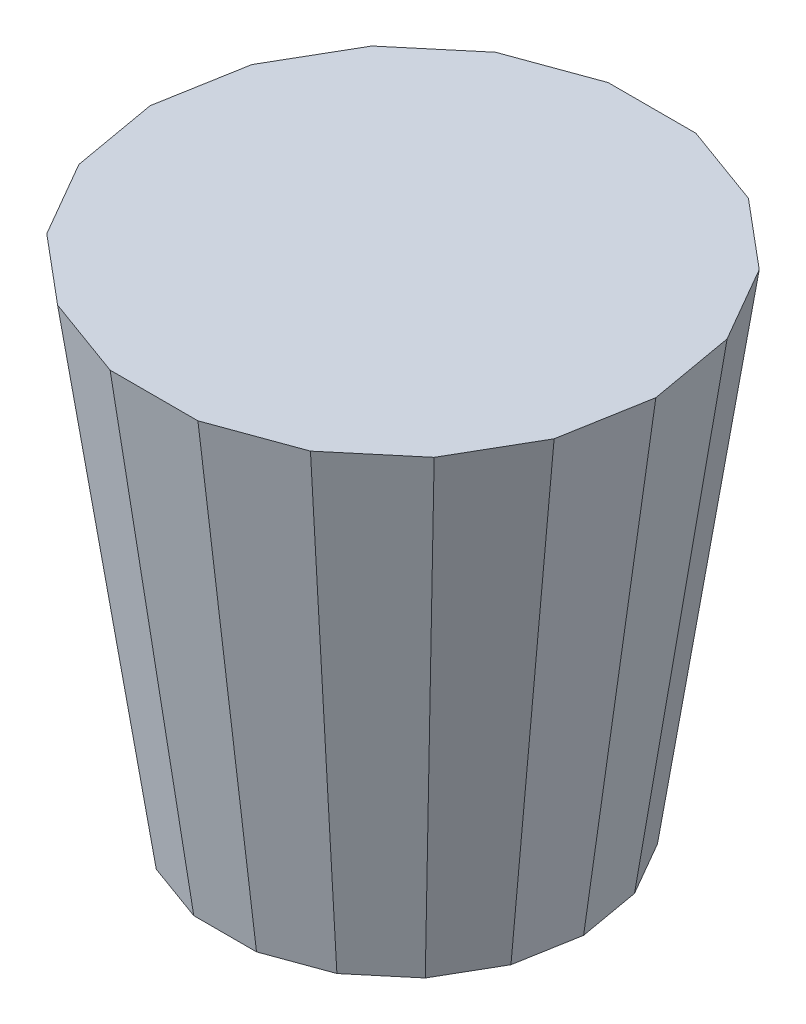
ISO-10303-21;
HEADER;
FILE_DESCRIPTION(('STEP AP214'),'2;1');
FILE_NAME('part.step','',(''),(''),'','','');
FILE_SCHEMA(('AUTOMOTIVE_DESIGN { 1 0 10303 214 1 1 1 1 }'));
ENDSEC;
DATA;
#1=APPLICATION_CONTEXT('core data for automotive mechanical design processes');
#2=APPLICATION_PROTOCOL_DEFINITION('international standard','automotive_design',2000,#1);
#3=PRODUCT_CONTEXT('',#1,'mechanical');
#4=PRODUCT('Part','Part','',(#3));
#5=PRODUCT_RELATED_PRODUCT_CATEGORY('part','',(#4));
#6=PRODUCT_DEFINITION_FORMATION('','',#4);
#7=PRODUCT_DEFINITION_CONTEXT('part definition',#1,'design');
#8=PRODUCT_DEFINITION('design','',#6,#7);
#9=PRODUCT_DEFINITION_SHAPE('','',#8);
#10=(LENGTH_UNIT() NAMED_UNIT(*) SI_UNIT(.MILLI.,.METRE.));
#11=(NAMED_UNIT(*) PLANE_ANGLE_UNIT() SI_UNIT($,.RADIAN.));
#12=(NAMED_UNIT(*) SI_UNIT($,.STERADIAN.) SOLID_ANGLE_UNIT());
#13=UNCERTAINTY_MEASURE_WITH_UNIT(LENGTH_MEASURE(1.E-05),#10,'distance_accuracy_value','');
#14=(GEOMETRIC_REPRESENTATION_CONTEXT(3) GLOBAL_UNCERTAINTY_ASSIGNED_CONTEXT((#13)) GLOBAL_UNIT_ASSIGNED_CONTEXT((#10,
#11,#12)) REPRESENTATION_CONTEXT('',''));
#15=CARTESIAN_POINT('',(0.,0.,0.));
#16=DIRECTION('',(0.,0.,1.));
#17=DIRECTION('',(1.,0.,0.));
#18=AXIS2_PLACEMENT_3D('',#15,#16,#17);
#19=CARTESIAN_POINT('',(0.,-254.,0.));
#20=DIRECTION('',(0.,1.,0.));
#21=DIRECTION('',(0.,0.,1.));
#22=AXIS2_PLACEMENT_3D('',#19,#20,#21);
#23=PLANE('',#22);
#24=DIRECTION('',(-0.5,0.,0.866025403784439));
#25=VECTOR('',#24,1.);
#26=CARTESIAN_POINT('',(-70.0321517789801,-254.,-58.7639527282935));
#27=LINE('',#26,#25);
#28=CARTESIAN_POINT('',(-70.0321517789801,-254.,-58.7639527282935));
#29=VERTEX_POINT('',#28);
#30=CARTESIAN_POINT('',(-85.9071517789802,-254.,-31.2676461581375));
#31=VERTEX_POINT('',#30);
#32=EDGE_CURVE('E392',#29,#31,#27,.T.);
#33=ORIENTED_EDGE('',*,*,#32,.F.);
#34=DIRECTION('',(-0.766044443118977,0.,0.64278760968654));
#35=VECTOR('',#34,1.);
#36=CARTESIAN_POINT('',(-45.7102407099527,-254.,-79.1724593358411));
#37=LINE('',#36,#35);
#38=CARTESIAN_POINT('',(-45.7102407099527,-254.,-79.1724593358411));
#39=VERTEX_POINT('',#38);
#40=EDGE_CURVE('E382',#39,#29,#37,.T.);
#41=ORIENTED_EDGE('',*,*,#40,.F.);
#42=DIRECTION('',(-0.939692620785908,0.,0.34202014332567));
#43=VECTOR('',#42,1.);
#44=CARTESIAN_POINT('',(-15.875,-254.,-90.0315988864311));
#45=LINE('',#44,#43);
#46=CARTESIAN_POINT('',(-15.875,-254.,-90.0315988864311));
#47=VERTEX_POINT('',#46);
#48=EDGE_CURVE('E407',#47,#39,#45,.T.);
#49=ORIENTED_EDGE('',*,*,#48,.F.);
#50=DIRECTION('',(-1.,0.,0.));
#51=VECTOR('',#50,1.);
#52=CARTESIAN_POINT('',(15.8749999999998,-254.,-90.0315988864311));
#53=LINE('',#52,#51);
#54=CARTESIAN_POINT('',(15.8749999999998,-254.,-90.0315988864311));
#55=VERTEX_POINT('',#54);
#56=EDGE_CURVE('E593',#55,#47,#53,.T.);
#57=ORIENTED_EDGE('',*,*,#56,.F.);
#58=DIRECTION('',(-0.939692620785908,0.,-0.342020143325669));
#59=VECTOR('',#58,1.);
#60=CARTESIAN_POINT('',(45.7102407099525,-254.,-79.1724593358411));
#61=LINE('',#60,#59);
#62=CARTESIAN_POINT('',(45.7102407099525,-254.,-79.1724593358411));
#63=VERTEX_POINT('',#62);
#64=EDGE_CURVE('E589',#63,#55,#61,.T.);
#65=ORIENTED_EDGE('',*,*,#64,.F.);
#66=DIRECTION('',(-0.766044443118978,0.,-0.642787609686539));
#67=VECTOR('',#66,1.);
#68=CARTESIAN_POINT('',(70.0321517789801,-254.,-58.7639527282935));
#69=LINE('',#68,#67);
#70=CARTESIAN_POINT('',(70.0321517789801,-254.,-58.7639527282935));
#71=VERTEX_POINT('',#70);
#72=EDGE_CURVE('E585',#71,#63,#69,.T.);
#73=ORIENTED_EDGE('',*,*,#72,.F.);
#74=DIRECTION('',(-0.5,0.,-0.866025403784439));
#75=VECTOR('',#74,1.);
#76=CARTESIAN_POINT('',(85.90715177898,-254.,-31.2676461581376));
#77=LINE('',#76,#75);
#78=CARTESIAN_POINT('',(85.90715177898,-254.,-31.2676461581376));
#79=VERTEX_POINT('',#78);
#80=EDGE_CURVE('E581',#79,#71,#77,.T.);
#81=ORIENTED_EDGE('',*,*,#80,.F.);
#82=DIRECTION('',(-0.173648177666931,0.,-0.984807753012208));
#83=VECTOR('',#82,1.);
#84=CARTESIAN_POINT('',(91.4204814199051,-254.,0.));
#85=LINE('',#84,#83);
#86=CARTESIAN_POINT('',(91.4204814199051,-254.,0.));
#87=VERTEX_POINT('',#86);
#88=EDGE_CURVE('E577',#87,#79,#85,.T.);
#89=ORIENTED_EDGE('',*,*,#88,.F.);
#90=DIRECTION('',(0.17364817766693,0.,-0.984807753012208));
#91=VECTOR('',#90,1.);
#92=CARTESIAN_POINT('',(85.9071517789801,-254.,31.2676461581375));
#93=LINE('',#92,#91);
#94=CARTESIAN_POINT('',(85.9071517789801,-254.,31.2676461581375));
#95=VERTEX_POINT('',#94);
#96=EDGE_CURVE('E573',#95,#87,#93,.T.);
#97=ORIENTED_EDGE('',*,*,#96,.F.);
#98=DIRECTION('',(0.5,0.,-0.866025403784439));
#99=VECTOR('',#98,1.);
#100=CARTESIAN_POINT('',(70.0321517789801,-254.,58.7639527282935));
#101=LINE('',#100,#99);
#102=CARTESIAN_POINT('',(70.0321517789801,-254.,58.7639527282935));
#103=VERTEX_POINT('',#102);
#104=EDGE_CURVE('E569',#103,#95,#101,.T.);
#105=ORIENTED_EDGE('',*,*,#104,.F.);
#106=DIRECTION('',(0.766044443118977,0.,-0.64278760968654));
#107=VECTOR('',#106,1.);
#108=CARTESIAN_POINT('',(45.7102407099526,-254.,79.1724593358411));
#109=LINE('',#108,#107);
#110=CARTESIAN_POINT('',(45.7102407099526,-254.,79.1724593358411));
#111=VERTEX_POINT('',#110);
#112=EDGE_CURVE('E565',#111,#103,#109,.T.);
#113=ORIENTED_EDGE('',*,*,#112,.F.);
#114=DIRECTION('',(0.939692620785908,0.,-0.34202014332567));
#115=VECTOR('',#114,1.);
#116=CARTESIAN_POINT('',(15.875,-254.,90.0315988864311));
#117=LINE('',#116,#115);
#118=CARTESIAN_POINT('',(15.875,-254.,90.0315988864311));
#119=VERTEX_POINT('',#118);
#120=EDGE_CURVE('E561',#119,#111,#117,.T.);
#121=ORIENTED_EDGE('',*,*,#120,.F.);
#122=DIRECTION('',(1.,0.,0.));
#123=VECTOR('',#122,1.);
#124=CARTESIAN_POINT('',(-15.875,-254.,90.0315988864311));
#125=LINE('',#124,#123);
#126=CARTESIAN_POINT('',(-15.875,-254.,90.0315988864311));
#127=VERTEX_POINT('',#126);
#128=EDGE_CURVE('E557',#127,#119,#125,.T.);
#129=ORIENTED_EDGE('',*,*,#128,.F.);
#130=DIRECTION('',(0.939692620785908,0.,0.342020143325669));
#131=VECTOR('',#130,1.);
#132=CARTESIAN_POINT('',(-45.7102407099526,-254.,79.1724593358411));
#133=LINE('',#132,#131);
#134=CARTESIAN_POINT('',(-45.7102407099526,-254.,79.1724593358411));
#135=VERTEX_POINT('',#134);
#136=EDGE_CURVE('E553',#135,#127,#133,.T.);
#137=ORIENTED_EDGE('',*,*,#136,.F.);
#138=DIRECTION('',(0.766044443118978,0.,0.642787609686539));
#139=VECTOR('',#138,1.);
#140=CARTESIAN_POINT('',(-70.0321517789801,-254.,58.7639527282935));
#141=LINE('',#140,#139);
#142=CARTESIAN_POINT('',(-70.0321517789801,-254.,58.7639527282935));
#143=VERTEX_POINT('',#142);
#144=EDGE_CURVE('E549',#143,#135,#141,.T.);
#145=ORIENTED_EDGE('',*,*,#144,.F.);
#146=DIRECTION('',(0.5,0.,0.866025403784438));
#147=VECTOR('',#146,1.);
#148=CARTESIAN_POINT('',(-85.9071517789801,-254.,31.2676461581376));
#149=LINE('',#148,#147);
#150=CARTESIAN_POINT('',(-85.9071517789801,-254.,31.2676461581376));
#151=VERTEX_POINT('',#150);
#152=EDGE_CURVE('E544',#151,#143,#149,.T.);
#153=ORIENTED_EDGE('',*,*,#152,.F.);
#154=DIRECTION('',(0.173648177666931,0.,0.984807753012208));
#155=VECTOR('',#154,1.);
#156=CARTESIAN_POINT('',(-91.4204814199051,-254.,0.));
#157=LINE('',#156,#155);
#158=CARTESIAN_POINT('',(-91.4204814199051,-254.,0.));
#159=VERTEX_POINT('',#158);
#160=EDGE_CURVE('E542',#159,#151,#157,.T.);
#161=ORIENTED_EDGE('',*,*,#160,.F.);
#162=DIRECTION('',(-0.173648177666929,0.,0.984807753012208));
#163=VECTOR('',#162,1.);
#164=CARTESIAN_POINT('',(-85.9071517789802,-254.,-31.2676461581375));
#165=LINE('',#164,#163);
#166=EDGE_CURVE('E413',#31,#159,#165,.T.);
#167=ORIENTED_EDGE('',*,*,#166,.F.);
#168=EDGE_LOOP('',(#33,#41,#49,#57,#65,#73,#81,#89,#97,#105,#113,#121,#129,#137,#145,#153,#161,#167));
#169=FACE_BOUND('',#168,.T.);
#170=ADVANCED_FACE('F257',(#169),#23,.F.);
#171=CARTESIAN_POINT('',(0.,0.,0.));
#172=DIRECTION('',(0.,1.,0.));
#173=DIRECTION('',(0.,0.,1.));
#174=AXIS2_PLACEMENT_3D('',#171,#172,#173);
#175=PLANE('',#174);
#176=DIRECTION('',(1.,0.,0.));
#177=VECTOR('',#176,1.);
#178=CARTESIAN_POINT('',(-22.2250000000002,0.,126.044238441004));
#179=LINE('',#178,#177);
#180=CARTESIAN_POINT('',(-22.2250000000002,0.,126.044238441004));
#181=VERTEX_POINT('',#180);
#182=CARTESIAN_POINT('',(22.2249999999998,0.,126.044238441004));
#183=VERTEX_POINT('',#182);
#184=EDGE_CURVE('E615',#181,#183,#179,.T.);
#185=ORIENTED_EDGE('',*,*,#184,.T.);
#186=DIRECTION('',(0.939692620785908,0.,-0.342020143325669));
#187=VECTOR('',#186,1.);
#188=CARTESIAN_POINT('',(22.2249999999998,0.,126.044238441004));
#189=LINE('',#188,#187);
#190=CARTESIAN_POINT('',(63.9943369939339,0.,110.841443070178));
#191=VERTEX_POINT('',#190);
#192=EDGE_CURVE('E616',#183,#191,#189,.T.);
#193=ORIENTED_EDGE('',*,*,#192,.T.);
#194=DIRECTION('',(0.766044443118978,0.,-0.642787609686539));
#195=VECTOR('',#194,1.);
#196=CARTESIAN_POINT('',(63.9943369939339,0.,110.841443070178));
#197=LINE('',#196,#195);
#198=CARTESIAN_POINT('',(98.0450124905725,0.,82.2695338196112));
#199=VERTEX_POINT('',#198);
#200=EDGE_CURVE('E619',#191,#199,#197,.T.);
#201=ORIENTED_EDGE('',*,*,#200,.T.);
#202=DIRECTION('',(0.5,0.,-0.866025403784439));
#203=VECTOR('',#202,1.);
#204=CARTESIAN_POINT('',(98.0450124905725,0.,82.2695338196112));
#205=LINE('',#204,#203);
#206=CARTESIAN_POINT('',(120.270012490573,0.,43.7747046213928));
#207=VERTEX_POINT('',#206);
#208=EDGE_CURVE('E785',#199,#207,#205,.T.);
#209=ORIENTED_EDGE('',*,*,#208,.T.);
#210=DIRECTION('',(0.17364817766693,0.,-0.984807753012208));
#211=VECTOR('',#210,1.);
#212=CARTESIAN_POINT('',(120.270012490573,0.,43.7747046213928));
#213=LINE('',#212,#211);
#214=CARTESIAN_POINT('',(127.988673987868,0.,0.));
#215=VERTEX_POINT('',#214);
#216=EDGE_CURVE('E776',#207,#215,#213,.T.);
#217=ORIENTED_EDGE('',*,*,#216,.T.);
#218=DIRECTION('',(-0.173648177666929,0.,-0.984807753012208));
#219=VECTOR('',#218,1.);
#220=CARTESIAN_POINT('',(127.988673987868,0.,0.));
#221=LINE('',#220,#219);
#222=CARTESIAN_POINT('',(120.270012490573,0.,-43.7747046213926));
#223=VERTEX_POINT('',#222);
#224=EDGE_CURVE('E767',#215,#223,#221,.T.);
#225=ORIENTED_EDGE('',*,*,#224,.T.);
#226=DIRECTION('',(-0.5,0.,-0.866025403784439));
#227=VECTOR('',#226,1.);
#228=CARTESIAN_POINT('',(120.270012490573,0.,-43.7747046213927));
#229=LINE('',#228,#227);
#230=CARTESIAN_POINT('',(98.0450124905725,0.,-82.2695338196111));
#231=VERTEX_POINT('',#230);
#232=EDGE_CURVE('E758',#223,#231,#229,.T.);
#233=ORIENTED_EDGE('',*,*,#232,.T.);
#234=DIRECTION('',(-0.766044443118978,0.,-0.64278760968654));
#235=VECTOR('',#234,1.);
#236=CARTESIAN_POINT('',(98.0450124905725,0.,-82.2695338196111));
#237=LINE('',#236,#235);
#238=CARTESIAN_POINT('',(63.9943369939338,0.,-110.841443070178));
#239=VERTEX_POINT('',#238);
#240=EDGE_CURVE('E749',#231,#239,#237,.T.);
#241=ORIENTED_EDGE('',*,*,#240,.T.);
#242=DIRECTION('',(-0.939692620785908,0.,-0.342020143325669));
#243=VECTOR('',#242,1.);
#244=CARTESIAN_POINT('',(63.9943369939338,0.,-110.841443070178));
#245=LINE('',#244,#243);
#246=CARTESIAN_POINT('',(22.2249999999995,0.,-126.044238441004));
#247=VERTEX_POINT('',#246);
#248=EDGE_CURVE('E740',#239,#247,#245,.T.);
#249=ORIENTED_EDGE('',*,*,#248,.T.);
#250=DIRECTION('',(-1.,0.,0.));
#251=VECTOR('',#250,1.);
#252=CARTESIAN_POINT('',(22.2249999999995,0.,-126.044238441004));
#253=LINE('',#252,#251);
#254=CARTESIAN_POINT('',(-22.2249999999998,0.,-126.044238441004));
#255=VERTEX_POINT('',#254);
#256=EDGE_CURVE('E731',#247,#255,#253,.T.);
#257=ORIENTED_EDGE('',*,*,#256,.T.);
#258=DIRECTION('',(-0.939692620785908,0.,0.342020143325669));
#259=VECTOR('',#258,1.);
#260=CARTESIAN_POINT('',(-22.2249999999998,0.,-126.044238441004));
#261=LINE('',#260,#259);
#262=CARTESIAN_POINT('',(-63.9943369939339,0.,-110.841443070178));
#263=VERTEX_POINT('',#262);
#264=EDGE_CURVE('E722',#255,#263,#261,.T.);
#265=ORIENTED_EDGE('',*,*,#264,.T.);
#266=DIRECTION('',(-0.766044443118978,0.,0.64278760968654));
#267=VECTOR('',#266,1.);
#268=CARTESIAN_POINT('',(-63.9943369939339,0.,-110.841443070178));
#269=LINE('',#268,#267);
#270=CARTESIAN_POINT('',(-98.0450124905726,0.,-82.2695338196112));
#271=VERTEX_POINT('',#270);
#272=EDGE_CURVE('E714',#263,#271,#269,.T.);
#273=ORIENTED_EDGE('',*,*,#272,.T.);
#274=DIRECTION('',(-0.5,0.,0.866025403784439));
#275=VECTOR('',#274,1.);
#276=CARTESIAN_POINT('',(-98.0450124905726,0.,-82.2695338196112));
#277=LINE('',#276,#275);
#278=CARTESIAN_POINT('',(-120.270012490573,0.,-43.7747046213928));
#279=VERTEX_POINT('',#278);
#280=EDGE_CURVE('E396',#271,#279,#277,.T.);
#281=ORIENTED_EDGE('',*,*,#280,.T.);
#282=DIRECTION('',(-0.17364817766693,0.,0.984807753012208));
#283=VECTOR('',#282,1.);
#284=CARTESIAN_POINT('',(-120.270012490573,0.,-43.7747046213928));
#285=LINE('',#284,#283);
#286=CARTESIAN_POINT('',(-127.988673987868,0.,0.));
#287=VERTEX_POINT('',#286);
#288=EDGE_CURVE('E698',#279,#287,#285,.T.);
#289=ORIENTED_EDGE('',*,*,#288,.T.);
#290=DIRECTION('',(0.17364817766693,0.,0.984807753012208));
#291=VECTOR('',#290,1.);
#292=CARTESIAN_POINT('',(-127.988673987868,0.,0.));
#293=LINE('',#292,#291);
#294=CARTESIAN_POINT('',(-120.270012490573,0.,43.7747046213927));
#295=VERTEX_POINT('',#294);
#296=EDGE_CURVE('E689',#287,#295,#293,.T.);
#297=ORIENTED_EDGE('',*,*,#296,.T.);
#298=DIRECTION('',(0.499999999999999,0.,0.866025403784439));
#299=VECTOR('',#298,1.);
#300=CARTESIAN_POINT('',(-120.270012490573,0.,43.7747046213927));
#301=LINE('',#300,#299);
#302=CARTESIAN_POINT('',(-98.0450124905727,0.,82.2695338196112));
#303=VERTEX_POINT('',#302);
#304=EDGE_CURVE('E683',#295,#303,#301,.T.);
#305=ORIENTED_EDGE('',*,*,#304,.T.);
#306=DIRECTION('',(0.766044443118978,0.,0.64278760968654));
#307=VECTOR('',#306,1.);
#308=CARTESIAN_POINT('',(-98.0450124905727,0.,82.2695338196112));
#309=LINE('',#308,#307);
#310=CARTESIAN_POINT('',(-63.994336993934,0.,110.841443070178));
#311=VERTEX_POINT('',#310);
#312=EDGE_CURVE('E269',#303,#311,#309,.T.);
#313=ORIENTED_EDGE('',*,*,#312,.T.);
#314=DIRECTION('',(0.939692620785908,0.,0.34202014332567));
#315=VECTOR('',#314,1.);
#316=CARTESIAN_POINT('',(-63.994336993934,0.,110.841443070178));
#317=LINE('',#316,#315);
#318=EDGE_CURVE('E13',#311,#181,#317,.T.);
#319=ORIENTED_EDGE('',*,*,#318,.T.);
#320=EDGE_LOOP('',(#185,#193,#201,#209,#217,#225,#233,#241,#249,#257,#265,#273,#281,#289,#297,
#305,#313,#319));
#321=FACE_BOUND('',#320,.T.);
#322=ADVANCED_FACE('F434',(#321),#175,.T.);
#323=CARTESIAN_POINT('',(-120.270012490573,0.,43.7747046213927));
#324=DIRECTION('',(-0.975056154422239,-0.140378115037361,0.17192870773048));
#325=DIRECTION('',(-0.17364817766693,0.,-0.984807753012208));
#326=AXIS2_PLACEMENT_3D('',#323,#324,#325);
#327=PLANE('',#326);
#328=ORIENTED_EDGE('',*,*,#296,.F.);
#329=CARTESIAN_POINT('',(-127.988673987868,0.,0.));
#330=CARTESIAN_POINT('',(-115.799276465214,-84.6666666666666,0.));
#331=CARTESIAN_POINT('',(-103.609878942559,-169.333333333333,0.));
#332=CARTESIAN_POINT('',(-91.4204814199051,-254.,0.));
#333=B_SPLINE_CURVE_WITH_KNOTS('',3,(#329,#330,#331,#332),.UNSPECIFIED.,.F.,.F.,(4,4),(0.,1.),.UNSPECIFIED.);
#334=EDGE_CURVE('E925',#287,#159,#333,.T.);
#335=ORIENTED_EDGE('',*,*,#334,.T.);
#336=ORIENTED_EDGE('',*,*,#160,.T.);
#337=CARTESIAN_POINT('',(-120.270012490573,0.,43.7747046213927));
#338=CARTESIAN_POINT('',(-108.815725586709,-84.6666666666667,39.605685133641));
#339=CARTESIAN_POINT('',(-97.3614386828443,-169.333333333333,35.4366656458893));
#340=CARTESIAN_POINT('',(-85.9071517789801,-254.,31.2676461581376));
#341=B_SPLINE_CURVE_WITH_KNOTS('',3,(#337,#338,#339,#340),.UNSPECIFIED.,.F.,.F.,(4,4),(0.,1.),.UNSPECIFIED.);
#342=EDGE_CURVE('E931',#295,#151,#341,.T.);
#343=ORIENTED_EDGE('',*,*,#342,.F.);
#344=EDGE_LOOP('',(#328,#335,#336,#343));
#345=FACE_BOUND('',#344,.T.);
#346=ADVANCED_FACE('F436',(#345),#327,.T.);
#347=CARTESIAN_POINT('',(-98.0450124905727,0.,82.2695338196112));
#348=DIRECTION('',(-0.857449991902688,-0.140378115037361,0.495048983641658));
#349=DIRECTION('',(-0.499999999999999,0.,-0.866025403784439));
#350=AXIS2_PLACEMENT_3D('',#347,#348,#349);
#351=PLANE('',#350);
#352=ORIENTED_EDGE('',*,*,#304,.F.);
#353=ORIENTED_EDGE('',*,*,#342,.T.);
#354=ORIENTED_EDGE('',*,*,#152,.T.);
#355=CARTESIAN_POINT('',(-98.0450124905727,0.,82.2695338196112));
#356=CARTESIAN_POINT('',(-88.7073922533751,-84.6666666666667,74.4343401225053));
#357=CARTESIAN_POINT('',(-79.3697720161776,-169.333333333333,66.5991464253994));
#358=CARTESIAN_POINT('',(-70.0321517789801,-254.,58.7639527282935));
#359=B_SPLINE_CURVE_WITH_KNOTS('',3,(#355,#356,#357,#358),.UNSPECIFIED.,.F.,.F.,(4,4),(0.,1.),.UNSPECIFIED.);
#360=EDGE_CURVE('E941',#303,#143,#359,.T.);
#361=ORIENTED_EDGE('',*,*,#360,.F.);
#362=EDGE_LOOP('',(#352,#353,#354,#361));
#363=FACE_BOUND('',#362,.T.);
#364=ADVANCED_FACE('F991',(#363),#351,.T.);
#365=CARTESIAN_POINT('',(-63.994336993934,0.,110.841443070178));
#366=DIRECTION('',(-0.636422705745546,-0.14037811503736,0.758459045980781));
#367=DIRECTION('',(-0.766044443118978,0.,-0.64278760968654));
#368=AXIS2_PLACEMENT_3D('',#365,#366,#367);
#369=PLANE('',#368);
#370=ORIENTED_EDGE('',*,*,#312,.F.);
#371=ORIENTED_EDGE('',*,*,#360,.T.);
#372=ORIENTED_EDGE('',*,*,#144,.T.);
#373=CARTESIAN_POINT('',(-63.994336993934,0.,110.841443070178));
#374=CARTESIAN_POINT('',(-57.8996382326069,-84.6666666666667,100.285115158732));
#375=CARTESIAN_POINT('',(-51.8049394712797,-169.333333333333,89.7287872472867));
#376=CARTESIAN_POINT('',(-45.7102407099526,-254.,79.1724593358411));
#377=B_SPLINE_CURVE_WITH_KNOTS('',3,(#373,#374,#375,#376),.UNSPECIFIED.,.F.,.F.,(4,4),(0.,1.),.UNSPECIFIED.);
#378=EDGE_CURVE('E649',#311,#135,#377,.T.);
#379=ORIENTED_EDGE('',*,*,#378,.F.);
#380=EDGE_LOOP('',(#370,#371,#372,#379));
#381=FACE_BOUND('',#380,.T.);
#382=ADVANCED_FACE('F971',(#381),#369,.T.);
#383=CARTESIAN_POINT('',(-22.2250000000002,0.,126.044238441004));
#384=DIRECTION('',(-0.338633448676695,-0.14037811503736,0.930387753711261));
#385=DIRECTION('',(-0.939692620785908,0.,-0.34202014332567));
#386=AXIS2_PLACEMENT_3D('',#383,#384,#385);
#387=PLANE('',#386);
#388=ORIENTED_EDGE('',*,*,#318,.F.);
#389=ORIENTED_EDGE('',*,*,#378,.T.);
#390=ORIENTED_EDGE('',*,*,#136,.T.);
#391=CARTESIAN_POINT('',(-22.2250000000002,0.,126.044238441004));
#392=CARTESIAN_POINT('',(-20.1083333333335,-84.6666666666667,114.040025256146));
#393=CARTESIAN_POINT('',(-17.9916666666667,-169.333333333333,102.035812071289));
#394=CARTESIAN_POINT('',(-15.875,-254.,90.0315988864311));
#395=B_SPLINE_CURVE_WITH_KNOTS('',3,(#391,#392,#393,#394),.UNSPECIFIED.,.F.,.F.,(4,4),(0.,1.),.UNSPECIFIED.);
#396=EDGE_CURVE('E647',#181,#127,#395,.T.);
#397=ORIENTED_EDGE('',*,*,#396,.F.);
#398=EDGE_LOOP('',(#388,#389,#390,#397));
#399=FACE_BOUND('',#398,.T.);
#400=ADVANCED_FACE('F967',(#399),#387,.T.);
#401=CARTESIAN_POINT('',(22.2249999999998,0.,126.044238441004));
#402=DIRECTION('',(0.,-0.14037811503736,0.990097967283318));
#403=DIRECTION('',(-1.,0.,0.));
#404=AXIS2_PLACEMENT_3D('',#401,#402,#403);
#405=PLANE('',#404);
#406=ORIENTED_EDGE('',*,*,#184,.F.);
#407=ORIENTED_EDGE('',*,*,#396,.T.);
#408=ORIENTED_EDGE('',*,*,#128,.T.);
#409=CARTESIAN_POINT('',(22.2249999999998,0.,126.044238441004));
#410=CARTESIAN_POINT('',(20.1083333333332,-84.6666666666667,114.040025256146));
#411=CARTESIAN_POINT('',(17.9916666666666,-169.333333333333,102.035812071289));
#412=CARTESIAN_POINT('',(15.875,-254.,90.0315988864311));
#413=B_SPLINE_CURVE_WITH_KNOTS('',3,(#409,#410,#411,#412),.UNSPECIFIED.,.F.,.F.,(4,4),(0.,1.),.UNSPECIFIED.);
#414=EDGE_CURVE('E636',#183,#119,#413,.T.);
#415=ORIENTED_EDGE('',*,*,#414,.F.);
#416=EDGE_LOOP('',(#406,#407,#408,#415));
#417=FACE_BOUND('',#416,.T.);
#418=ADVANCED_FACE('F642',(#417),#405,.T.);
#419=CARTESIAN_POINT('',(63.9943369939339,0.,110.841443070178));
#420=DIRECTION('',(0.338633448676693,-0.14037811503736,0.930387753711262));
#421=DIRECTION('',(-0.939692620785908,0.,0.342020143325669));
#422=AXIS2_PLACEMENT_3D('',#419,#420,#421);
#423=PLANE('',#422);
#424=ORIENTED_EDGE('',*,*,#192,.F.);
#425=ORIENTED_EDGE('',*,*,#414,.T.);
#426=ORIENTED_EDGE('',*,*,#120,.T.);
#427=CARTESIAN_POINT('',(63.9943369939339,0.,110.841443070178));
#428=CARTESIAN_POINT('',(57.8996382326068,-84.6666666666667,100.285115158732));
#429=CARTESIAN_POINT('',(51.8049394712797,-169.333333333333,89.7287872472867));
#430=CARTESIAN_POINT('',(45.7102407099526,-254.,79.1724593358411));
#431=B_SPLINE_CURVE_WITH_KNOTS('',3,(#427,#428,#429,#430),.UNSPECIFIED.,.F.,.F.,(4,4),(0.,1.),.UNSPECIFIED.);
#432=EDGE_CURVE('E638',#191,#111,#431,.T.);
#433=ORIENTED_EDGE('',*,*,#432,.F.);
#434=EDGE_LOOP('',(#424,#425,#426,#433));
#435=FACE_BOUND('',#434,.T.);
#436=ADVANCED_FACE('F635',(#435),#423,.T.);
#437=CARTESIAN_POINT('',(98.0450124905725,0.,82.2695338196112));
#438=DIRECTION('',(0.636422705745545,-0.14037811503736,0.758459045980781));
#439=DIRECTION('',(-0.766044443118978,0.,0.642787609686539));
#440=AXIS2_PLACEMENT_3D('',#437,#438,#439);
#441=PLANE('',#440);
#442=ORIENTED_EDGE('',*,*,#200,.F.);
#443=ORIENTED_EDGE('',*,*,#432,.T.);
#444=ORIENTED_EDGE('',*,*,#112,.T.);
#445=CARTESIAN_POINT('',(98.0450124905725,0.,82.2695338196112));
#446=CARTESIAN_POINT('',(88.707392253375,-84.6666666666667,74.4343401225053));
#447=CARTESIAN_POINT('',(79.3697720161775,-169.333333333333,66.5991464253994));
#448=CARTESIAN_POINT('',(70.0321517789801,-254.,58.7639527282935));
#449=B_SPLINE_CURVE_WITH_KNOTS('',3,(#445,#446,#447,#448),.UNSPECIFIED.,.F.,.F.,(4,4),(0.,1.),.UNSPECIFIED.);
#450=EDGE_CURVE('E651',#199,#103,#449,.T.);
#451=ORIENTED_EDGE('',*,*,#450,.F.);
#452=EDGE_LOOP('',(#442,#443,#444,#451));
#453=FACE_BOUND('',#452,.T.);
#454=ADVANCED_FACE('F818',(#453),#441,.T.);
#455=CARTESIAN_POINT('',(120.270012490573,0.,43.7747046213928));
#456=DIRECTION('',(0.857449991902687,-0.14037811503736,0.495048983641658));
#457=DIRECTION('',(-0.5,0.,0.866025403784439));
#458=AXIS2_PLACEMENT_3D('',#455,#456,#457);
#459=PLANE('',#458);
#460=ORIENTED_EDGE('',*,*,#208,.F.);
#461=ORIENTED_EDGE('',*,*,#450,.T.);
#462=ORIENTED_EDGE('',*,*,#104,.T.);
#463=CARTESIAN_POINT('',(120.270012490573,0.,43.7747046213928));
#464=CARTESIAN_POINT('',(108.815725586708,-84.6666666666667,39.605685133641));
#465=CARTESIAN_POINT('',(97.3614386828442,-169.333333333333,35.4366656458893));
#466=CARTESIAN_POINT('',(85.9071517789801,-254.,31.2676461581375));
#467=B_SPLINE_CURVE_WITH_KNOTS('',3,(#463,#464,#465,#466),.UNSPECIFIED.,.F.,.F.,(4,4),(0.,1.),.UNSPECIFIED.);
#468=EDGE_CURVE('E814',#207,#95,#467,.T.);
#469=ORIENTED_EDGE('',*,*,#468,.F.);
#470=EDGE_LOOP('',(#460,#461,#462,#469));
#471=FACE_BOUND('',#470,.T.);
#472=ADVANCED_FACE('F812',(#471),#459,.T.);
#473=CARTESIAN_POINT('',(127.988673987868,0.,0.));
#474=DIRECTION('',(0.975056154422239,-0.14037811503736,0.17192870773048));
#475=DIRECTION('',(-0.17364817766693,0.,0.984807753012208));
#476=AXIS2_PLACEMENT_3D('',#473,#474,#475);
#477=PLANE('',#476);
#478=ORIENTED_EDGE('',*,*,#216,.F.);
#479=ORIENTED_EDGE('',*,*,#468,.T.);
#480=ORIENTED_EDGE('',*,*,#96,.T.);
#481=CARTESIAN_POINT('',(127.988673987868,0.,0.));
#482=CARTESIAN_POINT('',(115.799276465213,-84.6666666666667,0.));
#483=CARTESIAN_POINT('',(103.609878942559,-169.333333333333,0.));
#484=CARTESIAN_POINT('',(91.4204814199051,-254.,0.));
#485=B_SPLINE_CURVE_WITH_KNOTS('',3,(#481,#482,#483,#484),.UNSPECIFIED.,.F.,.F.,(4,4),(0.,1.),.UNSPECIFIED.);
#486=EDGE_CURVE('E822',#215,#87,#485,.T.);
#487=ORIENTED_EDGE('',*,*,#486,.F.);
#488=EDGE_LOOP('',(#478,#479,#480,#487));
#489=FACE_BOUND('',#488,.T.);
#490=ADVANCED_FACE('F1067',(#489),#477,.T.);
#491=CARTESIAN_POINT('',(120.270012490573,0.,-43.7747046213926));
#492=DIRECTION('',(0.975056154422239,-0.14037811503736,-0.171928707730479));
#493=DIRECTION('',(0.173648177666929,0.,0.984807753012208));
#494=AXIS2_PLACEMENT_3D('',#491,#492,#493);
#495=PLANE('',#494);
#496=ORIENTED_EDGE('',*,*,#224,.F.);
#497=ORIENTED_EDGE('',*,*,#486,.T.);
#498=ORIENTED_EDGE('',*,*,#88,.T.);
#499=CARTESIAN_POINT('',(120.270012490573,0.,-43.7747046213926));
#500=CARTESIAN_POINT('',(108.815725586708,-84.6666666666667,-39.605685133641));
#501=CARTESIAN_POINT('',(97.3614386828442,-169.333333333333,-35.4366656458893));
#502=CARTESIAN_POINT('',(85.90715177898,-254.,-31.2676461581376));
#503=B_SPLINE_CURVE_WITH_KNOTS('',3,(#499,#500,#501,#502),.UNSPECIFIED.,.F.,.F.,(4,4),(0.,1.),.UNSPECIFIED.);
#504=EDGE_CURVE('E848',#223,#79,#503,.T.);
#505=ORIENTED_EDGE('',*,*,#504,.F.);
#506=EDGE_LOOP('',(#496,#497,#498,#505));
#507=FACE_BOUND('',#506,.T.);
#508=ADVANCED_FACE('F1086',(#507),#495,.T.);
#509=CARTESIAN_POINT('',(98.0450124905725,0.,-82.2695338196111));
#510=DIRECTION('',(0.857449991902687,-0.14037811503736,-0.495048983641658));
#511=DIRECTION('',(0.5,0.,0.866025403784439));
#512=AXIS2_PLACEMENT_3D('',#509,#510,#511);
#513=PLANE('',#512);
#514=ORIENTED_EDGE('',*,*,#232,.F.);
#515=ORIENTED_EDGE('',*,*,#504,.T.);
#516=ORIENTED_EDGE('',*,*,#80,.T.);
#517=CARTESIAN_POINT('',(98.0450124905725,0.,-82.2695338196111));
#518=CARTESIAN_POINT('',(88.707392253375,-84.6666666666667,-74.4343401225052));
#519=CARTESIAN_POINT('',(79.3697720161775,-169.333333333333,-66.5991464253994));
#520=CARTESIAN_POINT('',(70.0321517789801,-254.,-58.7639527282935));
#521=B_SPLINE_CURVE_WITH_KNOTS('',3,(#517,#518,#519,#520),.UNSPECIFIED.,.F.,.F.,(4,4),(0.,1.),.UNSPECIFIED.);
#522=EDGE_CURVE('E858',#231,#71,#521,.T.);
#523=ORIENTED_EDGE('',*,*,#522,.F.);
#524=EDGE_LOOP('',(#514,#515,#516,#523));
#525=FACE_BOUND('',#524,.T.);
#526=ADVANCED_FACE('F1126',(#525),#513,.T.);
#527=CARTESIAN_POINT('',(63.9943369939338,0.,-110.841443070178));
#528=DIRECTION('',(0.636422705745546,-0.14037811503736,-0.758459045980781));
#529=DIRECTION('',(0.766044443118978,0.,0.64278760968654));
#530=AXIS2_PLACEMENT_3D('',#527,#528,#529);
#531=PLANE('',#530);
#532=ORIENTED_EDGE('',*,*,#240,.F.);
#533=ORIENTED_EDGE('',*,*,#522,.T.);
#534=ORIENTED_EDGE('',*,*,#72,.T.);
#535=CARTESIAN_POINT('',(63.9943369939338,0.,-110.841443070178));
#536=CARTESIAN_POINT('',(57.8996382326067,-84.6666666666667,-100.285115158732));
#537=CARTESIAN_POINT('',(51.8049394712796,-169.333333333333,-89.7287872472867));
#538=CARTESIAN_POINT('',(45.7102407099525,-254.,-79.1724593358411));
#539=B_SPLINE_CURVE_WITH_KNOTS('',3,(#535,#536,#537,#538),.UNSPECIFIED.,.F.,.F.,(4,4),(0.,1.),.UNSPECIFIED.);
#540=EDGE_CURVE('E868',#239,#63,#539,.T.);
#541=ORIENTED_EDGE('',*,*,#540,.F.);
#542=EDGE_LOOP('',(#532,#533,#534,#541));
#543=FACE_BOUND('',#542,.T.);
#544=ADVANCED_FACE('F1135',(#543),#531,.T.);
#545=CARTESIAN_POINT('',(22.2249999999995,0.,-126.044238441004));
#546=DIRECTION('',(0.338633448676694,-0.14037811503736,-0.930387753711261));
#547=DIRECTION('',(0.939692620785908,0.,0.342020143325669));
#548=AXIS2_PLACEMENT_3D('',#545,#546,#547);
#549=PLANE('',#548);
#550=ORIENTED_EDGE('',*,*,#248,.F.);
#551=ORIENTED_EDGE('',*,*,#540,.T.);
#552=ORIENTED_EDGE('',*,*,#64,.T.);
#553=CARTESIAN_POINT('',(22.2249999999995,0.,-126.044238441004));
#554=CARTESIAN_POINT('',(20.1083333333329,-84.6666666666667,-114.040025256146));
#555=CARTESIAN_POINT('',(17.9916666666664,-169.333333333333,-102.035812071289));
#556=CARTESIAN_POINT('',(15.8749999999998,-254.,-90.0315988864311));
#557=B_SPLINE_CURVE_WITH_KNOTS('',3,(#553,#554,#555,#556),.UNSPECIFIED.,.F.,.F.,(4,4),(0.,1.),.UNSPECIFIED.);
#558=EDGE_CURVE('E878',#247,#55,#557,.T.);
#559=ORIENTED_EDGE('',*,*,#558,.F.);
#560=EDGE_LOOP('',(#550,#551,#552,#559));
#561=FACE_BOUND('',#560,.T.);
#562=ADVANCED_FACE('F1174',(#561),#549,.T.);
#563=CARTESIAN_POINT('',(-22.2249999999998,0.,-126.044238441004));
#564=DIRECTION('',(0.,-0.140378115037361,-0.990097967283318));
#565=DIRECTION('',(1.,0.,0.));
#566=AXIS2_PLACEMENT_3D('',#563,#564,#565);
#567=PLANE('',#566);
#568=ORIENTED_EDGE('',*,*,#256,.F.);
#569=ORIENTED_EDGE('',*,*,#558,.T.);
#570=ORIENTED_EDGE('',*,*,#56,.T.);
#571=CARTESIAN_POINT('',(-22.2249999999998,0.,-126.044238441004));
#572=CARTESIAN_POINT('',(-20.1083333333332,-84.6666666666667,-114.040025256147));
#573=CARTESIAN_POINT('',(-17.9916666666666,-169.333333333333,-102.035812071289));
#574=CARTESIAN_POINT('',(-15.875,-254.,-90.0315988864311));
#575=B_SPLINE_CURVE_WITH_KNOTS('',3,(#571,#572,#573,#574),.UNSPECIFIED.,.F.,.F.,(4,4),(0.,1.),.UNSPECIFIED.);
#576=EDGE_CURVE('E888',#255,#47,#575,.T.);
#577=ORIENTED_EDGE('',*,*,#576,.F.);
#578=EDGE_LOOP('',(#568,#569,#570,#577));
#579=FACE_BOUND('',#578,.T.);
#580=ADVANCED_FACE('F1183',(#579),#567,.T.);
#581=CARTESIAN_POINT('',(-63.9943369939339,0.,-110.841443070178));
#582=DIRECTION('',(-0.338633448676694,-0.14037811503736,-0.930387753711261));
#583=DIRECTION('',(0.939692620785908,0.,-0.342020143325669));
#584=AXIS2_PLACEMENT_3D('',#581,#582,#583);
#585=PLANE('',#584);
#586=ORIENTED_EDGE('',*,*,#264,.F.);
#587=ORIENTED_EDGE('',*,*,#576,.T.);
#588=ORIENTED_EDGE('',*,*,#48,.T.);
#589=CARTESIAN_POINT('',(-63.9943369939339,0.,-110.841443070178));
#590=CARTESIAN_POINT('',(-57.8996382326068,-84.6666666666667,-100.285115158732));
#591=CARTESIAN_POINT('',(-51.8049394712797,-169.333333333333,-89.7287872472868));
#592=CARTESIAN_POINT('',(-45.7102407099527,-254.,-79.1724593358411));
#593=B_SPLINE_CURVE_WITH_KNOTS('',3,(#589,#590,#591,#592),.UNSPECIFIED.,.F.,.F.,(4,4),(0.,1.),.UNSPECIFIED.);
#594=EDGE_CURVE('E400',#263,#39,#593,.T.);
#595=ORIENTED_EDGE('',*,*,#594,.F.);
#596=EDGE_LOOP('',(#586,#587,#588,#595));
#597=FACE_BOUND('',#596,.T.);
#598=ADVANCED_FACE('F1221',(#597),#585,.T.);
#599=CARTESIAN_POINT('',(-98.0450124905726,0.,-82.2695338196112));
#600=DIRECTION('',(-0.636422705745545,-0.14037811503736,-0.758459045980781));
#601=DIRECTION('',(0.766044443118978,0.,-0.64278760968654));
#602=AXIS2_PLACEMENT_3D('',#599,#600,#601);
#603=PLANE('',#602);
#604=ORIENTED_EDGE('',*,*,#272,.F.);
#605=ORIENTED_EDGE('',*,*,#594,.T.);
#606=ORIENTED_EDGE('',*,*,#40,.T.);
#607=CARTESIAN_POINT('',(-98.0450124905726,0.,-82.2695338196112));
#608=CARTESIAN_POINT('',(-88.7073922533751,-84.6666666666667,-74.4343401225053));
#609=CARTESIAN_POINT('',(-79.3697720161776,-169.333333333333,-66.5991464253994));
#610=CARTESIAN_POINT('',(-70.0321517789801,-254.,-58.7639527282935));
#611=B_SPLINE_CURVE_WITH_KNOTS('',3,(#607,#608,#609,#610),.UNSPECIFIED.,.F.,.F.,(4,4),(0.,1.),.UNSPECIFIED.);
#612=EDGE_CURVE('E389',#271,#29,#611,.T.);
#613=ORIENTED_EDGE('',*,*,#612,.F.);
#614=EDGE_LOOP('',(#604,#605,#606,#613));
#615=FACE_BOUND('',#614,.T.);
#616=ADVANCED_FACE('F405',(#615),#603,.T.);
#617=CARTESIAN_POINT('',(-120.270012490573,0.,-43.7747046213928));
#618=DIRECTION('',(-0.857449991902687,-0.14037811503736,-0.495048983641659));
#619=DIRECTION('',(0.5,0.,-0.866025403784438));
#620=AXIS2_PLACEMENT_3D('',#617,#618,#619);
#621=PLANE('',#620);
#622=ORIENTED_EDGE('',*,*,#280,.F.);
#623=ORIENTED_EDGE('',*,*,#612,.T.);
#624=ORIENTED_EDGE('',*,*,#32,.T.);
#625=CARTESIAN_POINT('',(-120.270012490573,0.,-43.7747046213928));
#626=CARTESIAN_POINT('',(-108.815725586709,-84.6666666666667,-39.6056851336411));
#627=CARTESIAN_POINT('',(-97.3614386828443,-169.333333333333,-35.4366656458893));
#628=CARTESIAN_POINT('',(-85.9071517789802,-254.,-31.2676461581375));
#629=B_SPLINE_CURVE_WITH_KNOTS('',3,(#625,#626,#627,#628),.UNSPECIFIED.,.F.,.F.,(4,4),(0.,1.),.UNSPECIFIED.);
#630=EDGE_CURVE('E401',#279,#31,#629,.T.);
#631=ORIENTED_EDGE('',*,*,#630,.F.);
#632=EDGE_LOOP('',(#622,#623,#624,#631));
#633=FACE_BOUND('',#632,.T.);
#634=ADVANCED_FACE('F390',(#633),#621,.T.);
#635=CARTESIAN_POINT('',(-127.988673987868,0.,0.));
#636=DIRECTION('',(-0.975056154422239,-0.14037811503736,-0.17192870773048));
#637=DIRECTION('',(0.17364817766693,0.,-0.984807753012208));
#638=AXIS2_PLACEMENT_3D('',#635,#636,#637);
#639=PLANE('',#638);
#640=ORIENTED_EDGE('',*,*,#288,.F.);
#641=ORIENTED_EDGE('',*,*,#630,.T.);
#642=ORIENTED_EDGE('',*,*,#166,.T.);
#643=ORIENTED_EDGE('',*,*,#334,.F.);
#644=EDGE_LOOP('',(#640,#641,#642,#643));
#645=FACE_BOUND('',#644,.T.);
#646=ADVANCED_FACE('F259',(#645),#639,.T.);
#647=CLOSED_SHELL('',(#170,#322,#346,#364,#382,#400,#418,#436,#454,#472,#490,#508,#526,#544,
#562,#580,#598,#616,#634,#646));
#648=MANIFOLD_SOLID_BREP('B2',#647);
#649=ADVANCED_BREP_SHAPE_REPRESENTATION('',(#18,#648),#14);
#650=SHAPE_DEFINITION_REPRESENTATION(#9,#649);
ENDSEC;
END-ISO-10303-21;
